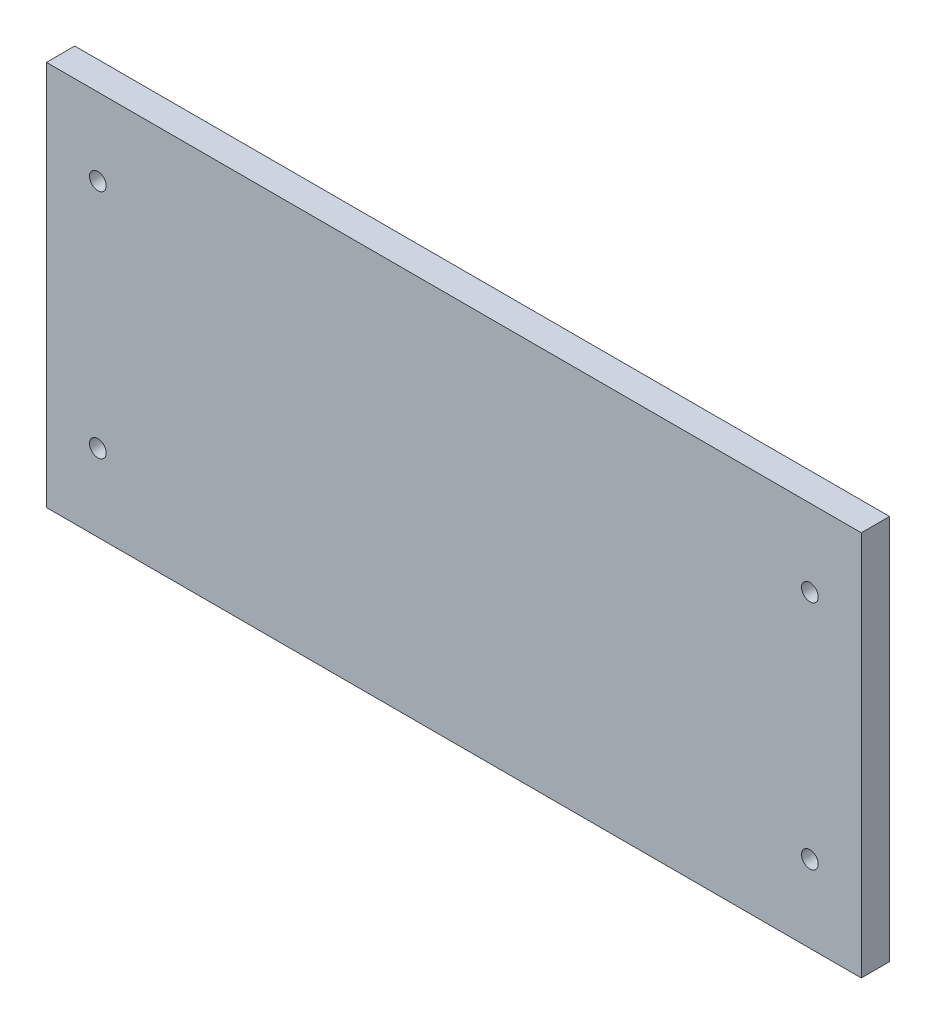
ISO-10303-21;
HEADER;
FILE_DESCRIPTION(('STEP AP214'),'2;1');
FILE_NAME('part.step','',(''),(''),'','','');
FILE_SCHEMA(('AUTOMOTIVE_DESIGN { 1 0 10303 214 1 1 1 1 }'));
ENDSEC;
DATA;
#1=APPLICATION_CONTEXT('core data for automotive mechanical design processes');
#2=APPLICATION_PROTOCOL_DEFINITION('international standard','automotive_design',2000,#1);
#3=PRODUCT_CONTEXT('',#1,'mechanical');
#4=PRODUCT('Part','Part','',(#3));
#5=PRODUCT_RELATED_PRODUCT_CATEGORY('part','',(#4));
#6=PRODUCT_DEFINITION_FORMATION('','',#4);
#7=PRODUCT_DEFINITION_CONTEXT('part definition',#1,'design');
#8=PRODUCT_DEFINITION('design','',#6,#7);
#9=PRODUCT_DEFINITION_SHAPE('','',#8);
#10=(LENGTH_UNIT() NAMED_UNIT(*) SI_UNIT(.MILLI.,.METRE.));
#11=(NAMED_UNIT(*) PLANE_ANGLE_UNIT() SI_UNIT($,.RADIAN.));
#12=(NAMED_UNIT(*) SI_UNIT($,.STERADIAN.) SOLID_ANGLE_UNIT());
#13=UNCERTAINTY_MEASURE_WITH_UNIT(LENGTH_MEASURE(1.E-05),#10,'distance_accuracy_value','');
#14=(GEOMETRIC_REPRESENTATION_CONTEXT(3) GLOBAL_UNCERTAINTY_ASSIGNED_CONTEXT((#13)) GLOBAL_UNIT_ASSIGNED_CONTEXT((#10,
#11,#12)) REPRESENTATION_CONTEXT('',''));
#15=CARTESIAN_POINT('',(0.,0.,0.));
#16=DIRECTION('',(0.,0.,1.));
#17=DIRECTION('',(1.,0.,0.));
#18=AXIS2_PLACEMENT_3D('',#15,#16,#17);
#19=CARTESIAN_POINT('',(0.,0.,11.));
#20=DIRECTION('',(0.,0.,-1.));
#21=DIRECTION('',(-1.,0.,0.));
#22=AXIS2_PLACEMENT_3D('',#19,#20,#21);
#23=PLANE('',#22);
#24=DIRECTION('',(0.,1.,0.));
#25=VECTOR('',#24,1.);
#26=CARTESIAN_POINT('',(158.5,-75.,11.));
#27=LINE('',#26,#25);
#28=CARTESIAN_POINT('',(158.5,-75.,11.));
#29=VERTEX_POINT('',#28);
#30=CARTESIAN_POINT('',(158.5,75.,11.));
#31=VERTEX_POINT('',#30);
#32=EDGE_CURVE('E86',#29,#31,#27,.T.);
#33=ORIENTED_EDGE('',*,*,#32,.T.);
#34=DIRECTION('',(-1.,0.,0.));
#35=VECTOR('',#34,1.);
#36=CARTESIAN_POINT('',(-158.5,75.,11.));
#37=LINE('',#36,#35);
#38=CARTESIAN_POINT('',(-158.5,75.,11.));
#39=VERTEX_POINT('',#38);
#40=EDGE_CURVE('E81',#31,#39,#37,.T.);
#41=ORIENTED_EDGE('',*,*,#40,.T.);
#42=DIRECTION('',(0.,-1.,0.));
#43=VECTOR('',#42,1.);
#44=CARTESIAN_POINT('',(-158.5,-75.,11.));
#45=LINE('',#44,#43);
#46=CARTESIAN_POINT('',(-158.5,-75.,11.));
#47=VERTEX_POINT('',#46);
#48=EDGE_CURVE('E84',#39,#47,#45,.T.);
#49=ORIENTED_EDGE('',*,*,#48,.T.);
#50=DIRECTION('',(1.,0.,0.));
#51=VECTOR('',#50,1.);
#52=CARTESIAN_POINT('',(-158.5,-75.,11.));
#53=LINE('',#52,#51);
#54=EDGE_CURVE('E51',#47,#29,#53,.T.);
#55=ORIENTED_EDGE('',*,*,#54,.T.);
#56=EDGE_LOOP('',(#33,#41,#49,#55));
#57=FACE_BOUND('',#56,.T.);
#58=CARTESIAN_POINT('',(-138.5,45.,11.));
#59=DIRECTION('',(0.,0.,1.));
#60=DIRECTION('',(1.,0.,0.));
#61=AXIS2_PLACEMENT_3D('',#58,#59,#60);
#62=CIRCLE('',#61,3.25000000000001);
#63=CARTESIAN_POINT('',(-135.25,45.,11.));
#64=VERTEX_POINT('',#63);
#65=EDGE_CURVE('E101',#64,#64,#62,.T.);
#66=ORIENTED_EDGE('',*,*,#65,.F.);
#67=EDGE_LOOP('',(#66));
#68=FACE_BOUND('',#67,.T.);
#69=CARTESIAN_POINT('',(138.5,45.,11.));
#70=DIRECTION('',(0.,0.,1.));
#71=DIRECTION('',(-1.,0.,0.));
#72=AXIS2_PLACEMENT_3D('',#69,#70,#71);
#73=CIRCLE('',#72,3.25000000000001);
#74=CARTESIAN_POINT('',(135.25,45.,11.));
#75=VERTEX_POINT('',#74);
#76=EDGE_CURVE('E116',#75,#75,#73,.T.);
#77=ORIENTED_EDGE('',*,*,#76,.F.);
#78=EDGE_LOOP('',(#77));
#79=FACE_BOUND('',#78,.T.);
#80=CARTESIAN_POINT('',(138.5,-45.,11.));
#81=DIRECTION('',(0.,0.,1.));
#82=DIRECTION('',(1.,0.,0.));
#83=AXIS2_PLACEMENT_3D('',#80,#81,#82);
#84=CIRCLE('',#83,3.25000000000001);
#85=CARTESIAN_POINT('',(141.75,-45.,11.));
#86=VERTEX_POINT('',#85);
#87=EDGE_CURVE('E122',#86,#86,#84,.T.);
#88=ORIENTED_EDGE('',*,*,#87,.F.);
#89=EDGE_LOOP('',(#88));
#90=FACE_BOUND('',#89,.T.);
#91=CARTESIAN_POINT('',(-138.5,-45.,11.));
#92=DIRECTION('',(0.,0.,1.));
#93=DIRECTION('',(-1.,0.,0.));
#94=AXIS2_PLACEMENT_3D('',#91,#92,#93);
#95=CIRCLE('',#94,3.25000000000001);
#96=CARTESIAN_POINT('',(-141.75,-45.,11.));
#97=VERTEX_POINT('',#96);
#98=EDGE_CURVE('E128',#97,#97,#95,.T.);
#99=ORIENTED_EDGE('',*,*,#98,.F.);
#100=EDGE_LOOP('',(#99));
#101=FACE_BOUND('',#100,.T.);
#102=ADVANCED_FACE('F34',(#57,#68,#79,#90,#101),#23,.F.);
#103=CARTESIAN_POINT('',(0.,0.,0.));
#104=DIRECTION('',(0.,0.,-1.));
#105=DIRECTION('',(-1.,0.,0.));
#106=AXIS2_PLACEMENT_3D('',#103,#104,#105);
#107=PLANE('',#106);
#108=CARTESIAN_POINT('',(138.5,-45.,0.));
#109=DIRECTION('',(0.,0.,1.));
#110=DIRECTION('',(1.,0.,0.));
#111=AXIS2_PLACEMENT_3D('',#108,#109,#110);
#112=CIRCLE('',#111,3.25000000000001);
#113=CARTESIAN_POINT('',(141.75,-45.,0.));
#114=VERTEX_POINT('',#113);
#115=EDGE_CURVE('E125',#114,#114,#112,.T.);
#116=ORIENTED_EDGE('',*,*,#115,.T.);
#117=EDGE_LOOP('',(#116));
#118=FACE_BOUND('',#117,.T.);
#119=CARTESIAN_POINT('',(-138.5,45.,0.));
#120=DIRECTION('',(0.,0.,1.));
#121=DIRECTION('',(1.,0.,0.));
#122=AXIS2_PLACEMENT_3D('',#119,#120,#121);
#123=CIRCLE('',#122,3.25000000000001);
#124=CARTESIAN_POINT('',(-135.25,45.,0.));
#125=VERTEX_POINT('',#124);
#126=EDGE_CURVE('E113',#125,#125,#123,.T.);
#127=ORIENTED_EDGE('',*,*,#126,.T.);
#128=EDGE_LOOP('',(#127));
#129=FACE_BOUND('',#128,.T.);
#130=DIRECTION('',(0.,1.,0.));
#131=VECTOR('',#130,1.);
#132=CARTESIAN_POINT('',(158.5,-75.,0.));
#133=LINE('',#132,#131);
#134=CARTESIAN_POINT('',(158.5,-75.,0.));
#135=VERTEX_POINT('',#134);
#136=CARTESIAN_POINT('',(158.5,75.,0.));
#137=VERTEX_POINT('',#136);
#138=EDGE_CURVE('E98',#135,#137,#133,.T.);
#139=ORIENTED_EDGE('',*,*,#138,.F.);
#140=DIRECTION('',(1.,0.,0.));
#141=VECTOR('',#140,1.);
#142=CARTESIAN_POINT('',(-158.5,-75.,0.));
#143=LINE('',#142,#141);
#144=CARTESIAN_POINT('',(-158.5,-75.,0.));
#145=VERTEX_POINT('',#144);
#146=EDGE_CURVE('E74',#145,#135,#143,.T.);
#147=ORIENTED_EDGE('',*,*,#146,.F.);
#148=DIRECTION('',(0.,-1.,0.));
#149=VECTOR('',#148,1.);
#150=CARTESIAN_POINT('',(-158.5,-75.,0.));
#151=LINE('',#150,#149);
#152=CARTESIAN_POINT('',(-158.5,75.,0.));
#153=VERTEX_POINT('',#152);
#154=EDGE_CURVE('E68',#153,#145,#151,.T.);
#155=ORIENTED_EDGE('',*,*,#154,.F.);
#156=DIRECTION('',(-1.,0.,0.));
#157=VECTOR('',#156,1.);
#158=CARTESIAN_POINT('',(-158.5,75.,0.));
#159=LINE('',#158,#157);
#160=EDGE_CURVE('E90',#137,#153,#159,.T.);
#161=ORIENTED_EDGE('',*,*,#160,.F.);
#162=EDGE_LOOP('',(#139,#147,#155,#161));
#163=FACE_BOUND('',#162,.T.);
#164=CARTESIAN_POINT('',(138.5,45.,0.));
#165=DIRECTION('',(0.,0.,1.));
#166=DIRECTION('',(-1.,0.,0.));
#167=AXIS2_PLACEMENT_3D('',#164,#165,#166);
#168=CIRCLE('',#167,3.25000000000001);
#169=CARTESIAN_POINT('',(135.25,45.,0.));
#170=VERTEX_POINT('',#169);
#171=EDGE_CURVE('E119',#170,#170,#168,.T.);
#172=ORIENTED_EDGE('',*,*,#171,.T.);
#173=EDGE_LOOP('',(#172));
#174=FACE_BOUND('',#173,.T.);
#175=CARTESIAN_POINT('',(-138.5,-45.,0.));
#176=DIRECTION('',(0.,0.,1.));
#177=DIRECTION('',(-1.,0.,0.));
#178=AXIS2_PLACEMENT_3D('',#175,#176,#177);
#179=CIRCLE('',#178,3.25000000000001);
#180=CARTESIAN_POINT('',(-141.75,-45.,0.));
#181=VERTEX_POINT('',#180);
#182=EDGE_CURVE('E131',#181,#181,#179,.T.);
#183=ORIENTED_EDGE('',*,*,#182,.T.);
#184=EDGE_LOOP('',(#183));
#185=FACE_BOUND('',#184,.T.);
#186=ADVANCED_FACE('F109',(#118,#129,#163,#174,#185),#107,.T.);
#187=CARTESIAN_POINT('',(158.5,-75.,11.));
#188=DIRECTION('',(-1.,0.,0.));
#189=DIRECTION('',(0.,0.,1.));
#190=AXIS2_PLACEMENT_3D('',#187,#188,#189);
#191=PLANE('',#190);
#192=ORIENTED_EDGE('',*,*,#138,.T.);
#193=DIRECTION('',(0.,0.,-1.));
#194=VECTOR('',#193,1.);
#195=CARTESIAN_POINT('',(158.5,75.,11.));
#196=LINE('',#195,#194);
#197=EDGE_CURVE('E11',#31,#137,#196,.T.);
#198=ORIENTED_EDGE('',*,*,#197,.F.);
#199=ORIENTED_EDGE('',*,*,#32,.F.);
#200=DIRECTION('',(0.,0.,-1.));
#201=VECTOR('',#200,1.);
#202=CARTESIAN_POINT('',(158.5,-75.,11.));
#203=LINE('',#202,#201);
#204=EDGE_CURVE('E94',#29,#135,#203,.T.);
#205=ORIENTED_EDGE('',*,*,#204,.T.);
#206=EDGE_LOOP('',(#192,#198,#199,#205));
#207=FACE_BOUND('',#206,.T.);
#208=ADVANCED_FACE('F36',(#207),#191,.F.);
#209=CARTESIAN_POINT('',(-158.5,75.,11.));
#210=DIRECTION('',(0.,-1.,0.));
#211=DIRECTION('',(0.,0.,-1.));
#212=AXIS2_PLACEMENT_3D('',#209,#210,#211);
#213=PLANE('',#212);
#214=ORIENTED_EDGE('',*,*,#160,.T.);
#215=DIRECTION('',(0.,0.,-1.));
#216=VECTOR('',#215,1.);
#217=CARTESIAN_POINT('',(-158.5,75.,11.));
#218=LINE('',#217,#216);
#219=EDGE_CURVE('E43',#39,#153,#218,.T.);
#220=ORIENTED_EDGE('',*,*,#219,.F.);
#221=ORIENTED_EDGE('',*,*,#40,.F.);
#222=ORIENTED_EDGE('',*,*,#197,.T.);
#223=EDGE_LOOP('',(#214,#220,#221,#222));
#224=FACE_BOUND('',#223,.T.);
#225=ADVANCED_FACE('F89',(#224),#213,.F.);
#226=CARTESIAN_POINT('',(-158.5,-75.,11.));
#227=DIRECTION('',(1.,0.,0.));
#228=DIRECTION('',(0.,0.,-1.));
#229=AXIS2_PLACEMENT_3D('',#226,#227,#228);
#230=PLANE('',#229);
#231=ORIENTED_EDGE('',*,*,#154,.T.);
#232=DIRECTION('',(0.,0.,-1.));
#233=VECTOR('',#232,1.);
#234=CARTESIAN_POINT('',(-158.5,-75.,11.));
#235=LINE('',#234,#233);
#236=EDGE_CURVE('E91',#47,#145,#235,.T.);
#237=ORIENTED_EDGE('',*,*,#236,.F.);
#238=ORIENTED_EDGE('',*,*,#48,.F.);
#239=ORIENTED_EDGE('',*,*,#219,.T.);
#240=EDGE_LOOP('',(#231,#237,#238,#239));
#241=FACE_BOUND('',#240,.T.);
#242=ADVANCED_FACE('F92',(#241),#230,.F.);
#243=CARTESIAN_POINT('',(-158.5,-75.,11.));
#244=DIRECTION('',(0.,1.,0.));
#245=DIRECTION('',(0.,0.,1.));
#246=AXIS2_PLACEMENT_3D('',#243,#244,#245);
#247=PLANE('',#246);
#248=ORIENTED_EDGE('',*,*,#146,.T.);
#249=ORIENTED_EDGE('',*,*,#204,.F.);
#250=ORIENTED_EDGE('',*,*,#54,.F.);
#251=ORIENTED_EDGE('',*,*,#236,.T.);
#252=EDGE_LOOP('',(#248,#249,#250,#251));
#253=FACE_BOUND('',#252,.T.);
#254=ADVANCED_FACE('F106',(#253),#247,.F.);
#255=CARTESIAN_POINT('',(-138.5,45.,11.));
#256=DIRECTION('',(0.,0.,-1.));
#257=DIRECTION('',(-1.,0.,0.));
#258=AXIS2_PLACEMENT_3D('',#255,#256,#257);
#259=CYLINDRICAL_SURFACE('',#258,3.25000000000001);
#260=ORIENTED_EDGE('',*,*,#65,.T.);
#261=EDGE_LOOP('',(#260));
#262=FACE_BOUND('',#261,.T.);
#263=ORIENTED_EDGE('',*,*,#126,.F.);
#264=EDGE_LOOP('',(#263));
#265=FACE_BOUND('',#264,.T.);
#266=ADVANCED_FACE('F148',(#262,#265),#259,.F.);
#267=CARTESIAN_POINT('',(138.5,45.,11.));
#268=DIRECTION('',(0.,0.,-1.));
#269=DIRECTION('',(-1.,0.,0.));
#270=AXIS2_PLACEMENT_3D('',#267,#268,#269);
#271=CYLINDRICAL_SURFACE('',#270,3.25000000000001);
#272=ORIENTED_EDGE('',*,*,#76,.T.);
#273=EDGE_LOOP('',(#272));
#274=FACE_BOUND('',#273,.T.);
#275=ORIENTED_EDGE('',*,*,#171,.F.);
#276=EDGE_LOOP('',(#275));
#277=FACE_BOUND('',#276,.T.);
#278=ADVANCED_FACE('F194',(#274,#277),#271,.F.);
#279=CARTESIAN_POINT('',(138.5,-45.,11.));
#280=DIRECTION('',(0.,0.,-1.));
#281=DIRECTION('',(-1.,0.,0.));
#282=AXIS2_PLACEMENT_3D('',#279,#280,#281);
#283=CYLINDRICAL_SURFACE('',#282,3.25000000000001);
#284=ORIENTED_EDGE('',*,*,#87,.T.);
#285=EDGE_LOOP('',(#284));
#286=FACE_BOUND('',#285,.T.);
#287=ORIENTED_EDGE('',*,*,#115,.F.);
#288=EDGE_LOOP('',(#287));
#289=FACE_BOUND('',#288,.T.);
#290=ADVANCED_FACE('F202',(#286,#289),#283,.F.);
#291=CARTESIAN_POINT('',(-138.5,-45.,11.));
#292=DIRECTION('',(0.,0.,-1.));
#293=DIRECTION('',(-1.,0.,0.));
#294=AXIS2_PLACEMENT_3D('',#291,#292,#293);
#295=CYLINDRICAL_SURFACE('',#294,3.25000000000001);
#296=ORIENTED_EDGE('',*,*,#98,.T.);
#297=EDGE_LOOP('',(#296));
#298=FACE_BOUND('',#297,.T.);
#299=ORIENTED_EDGE('',*,*,#182,.F.);
#300=EDGE_LOOP('',(#299));
#301=FACE_BOUND('',#300,.T.);
#302=ADVANCED_FACE('F137',(#298,#301),#295,.F.);
#303=CLOSED_SHELL('',(#102,#186,#208,#225,#242,#254,#266,#278,#290,#302));
#304=MANIFOLD_SOLID_BREP('B2',#303);
#305=ADVANCED_BREP_SHAPE_REPRESENTATION('',(#18,#304),#14);
#306=SHAPE_DEFINITION_REPRESENTATION(#9,#305);
ENDSEC;
END-ISO-10303-21;
